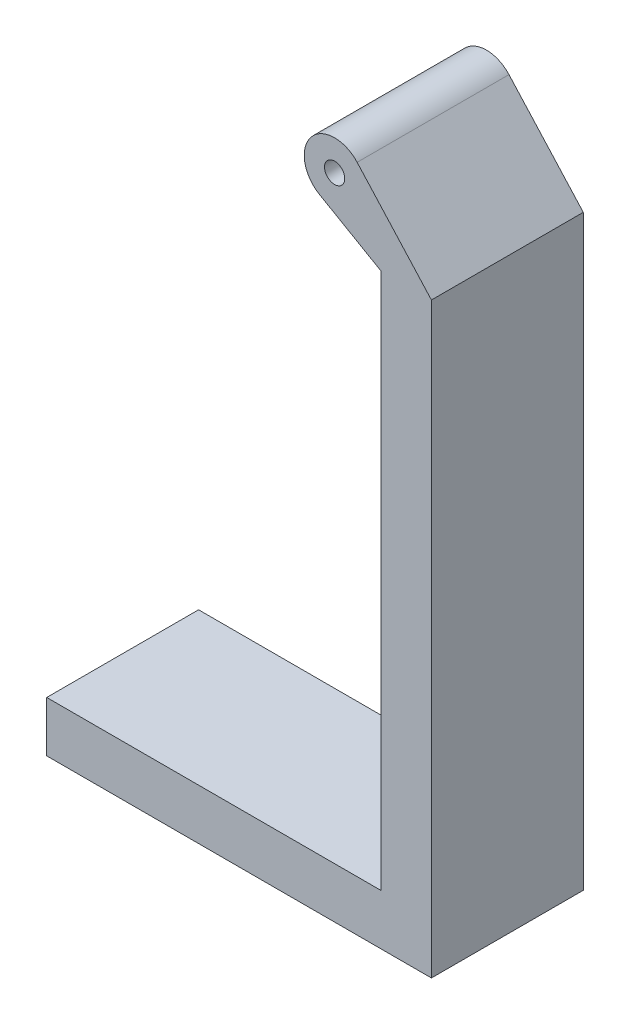
ISO-10303-21;
HEADER;
FILE_DESCRIPTION(('STEP AP214'),'2;1');
FILE_NAME('part.step','',(''),(''),'','','');
FILE_SCHEMA(('AUTOMOTIVE_DESIGN { 1 0 10303 214 1 1 1 1 }'));
ENDSEC;
DATA;
#1=APPLICATION_CONTEXT('core data for automotive mechanical design processes');
#2=APPLICATION_PROTOCOL_DEFINITION('international standard','automotive_design',2000,#1);
#3=PRODUCT_CONTEXT('',#1,'mechanical');
#4=PRODUCT('Part','Part','',(#3));
#5=PRODUCT_RELATED_PRODUCT_CATEGORY('part','',(#4));
#6=PRODUCT_DEFINITION_FORMATION('','',#4);
#7=PRODUCT_DEFINITION_CONTEXT('part definition',#1,'design');
#8=PRODUCT_DEFINITION('design','',#6,#7);
#9=PRODUCT_DEFINITION_SHAPE('','',#8);
#10=(LENGTH_UNIT() NAMED_UNIT(*) SI_UNIT(.MILLI.,.METRE.));
#11=(NAMED_UNIT(*) PLANE_ANGLE_UNIT() SI_UNIT($,.RADIAN.));
#12=(NAMED_UNIT(*) SI_UNIT($,.STERADIAN.) SOLID_ANGLE_UNIT());
#13=UNCERTAINTY_MEASURE_WITH_UNIT(LENGTH_MEASURE(1.E-05),#10,'distance_accuracy_value','');
#14=(GEOMETRIC_REPRESENTATION_CONTEXT(3) GLOBAL_UNCERTAINTY_ASSIGNED_CONTEXT((#13)) GLOBAL_UNIT_ASSIGNED_CONTEXT((#10,
#11,#12)) REPRESENTATION_CONTEXT('',''));
#15=CARTESIAN_POINT('',(0.,0.,0.));
#16=DIRECTION('',(0.,0.,1.));
#17=DIRECTION('',(1.,0.,0.));
#18=AXIS2_PLACEMENT_3D('',#15,#16,#17);
#19=CARTESIAN_POINT('',(0.,5.,15.));
#20=DIRECTION('',(1.,0.,0.));
#21=DIRECTION('',(0.,1.,0.));
#22=AXIS2_PLACEMENT_3D('',#19,#20,#21);
#23=PLANE('',#22);
#24=DIRECTION('',(0.,-1.,0.));
#25=VECTOR('',#24,1.);
#26=CARTESIAN_POINT('',(0.,5.,0.));
#27=LINE('',#26,#25);
#28=CARTESIAN_POINT('',(0.,5.,0.));
#29=VERTEX_POINT('',#28);
#30=CARTESIAN_POINT('',(0.,0.,0.));
#31=VERTEX_POINT('',#30);
#32=EDGE_CURVE('E128',#29,#31,#27,.T.);
#33=ORIENTED_EDGE('',*,*,#32,.T.);
#34=DIRECTION('',(0.,0.,-1.));
#35=VECTOR('',#34,1.);
#36=CARTESIAN_POINT('',(0.,0.,15.));
#37=LINE('',#36,#35);
#38=CARTESIAN_POINT('',(0.,0.,15.));
#39=VERTEX_POINT('',#38);
#40=EDGE_CURVE('E11',#39,#31,#37,.T.);
#41=ORIENTED_EDGE('',*,*,#40,.F.);
#42=DIRECTION('',(0.,-1.,0.));
#43=VECTOR('',#42,1.);
#44=CARTESIAN_POINT('',(0.,5.,15.));
#45=LINE('',#44,#43);
#46=CARTESIAN_POINT('',(0.,5.,15.));
#47=VERTEX_POINT('',#46);
#48=EDGE_CURVE('E132',#47,#39,#45,.T.);
#49=ORIENTED_EDGE('',*,*,#48,.F.);
#50=DIRECTION('',(0.,0.,-1.));
#51=VECTOR('',#50,1.);
#52=CARTESIAN_POINT('',(0.,5.,15.));
#53=LINE('',#52,#51);
#54=EDGE_CURVE('E137',#47,#29,#53,.T.);
#55=ORIENTED_EDGE('',*,*,#54,.T.);
#56=EDGE_LOOP('',(#33,#41,#49,#55));
#57=FACE_BOUND('',#56,.T.);
#58=ADVANCED_FACE('F33',(#57),#23,.F.);
#59=CARTESIAN_POINT('',(0.,0.,15.));
#60=DIRECTION('',(0.,1.,0.));
#61=DIRECTION('',(0.,0.,1.));
#62=AXIS2_PLACEMENT_3D('',#59,#60,#61);
#63=PLANE('',#62);
#64=DIRECTION('',(1.,0.,0.));
#65=VECTOR('',#64,1.);
#66=CARTESIAN_POINT('',(0.,0.,0.));
#67=LINE('',#66,#65);
#68=CARTESIAN_POINT('',(38.,0.,0.));
#69=VERTEX_POINT('',#68);
#70=EDGE_CURVE('E140',#31,#69,#67,.T.);
#71=ORIENTED_EDGE('',*,*,#70,.T.);
#72=DIRECTION('',(0.,0.,-1.));
#73=VECTOR('',#72,1.);
#74=CARTESIAN_POINT('',(38.,0.,15.));
#75=LINE('',#74,#73);
#76=CARTESIAN_POINT('',(38.,0.,15.));
#77=VERTEX_POINT('',#76);
#78=EDGE_CURVE('E42',#77,#69,#75,.T.);
#79=ORIENTED_EDGE('',*,*,#78,.F.);
#80=DIRECTION('',(1.,0.,0.));
#81=VECTOR('',#80,1.);
#82=CARTESIAN_POINT('',(0.,0.,15.));
#83=LINE('',#82,#81);
#84=EDGE_CURVE('E84',#39,#77,#83,.T.);
#85=ORIENTED_EDGE('',*,*,#84,.F.);
#86=ORIENTED_EDGE('',*,*,#40,.T.);
#87=EDGE_LOOP('',(#71,#79,#85,#86));
#88=FACE_BOUND('',#87,.T.);
#89=ADVANCED_FACE('F199',(#88),#63,.F.);
#90=CARTESIAN_POINT('',(38.,0.,15.));
#91=DIRECTION('',(-1.,0.,0.));
#92=DIRECTION('',(0.,0.,1.));
#93=AXIS2_PLACEMENT_3D('',#90,#91,#92);
#94=PLANE('',#93);
#95=DIRECTION('',(0.,1.,0.));
#96=VECTOR('',#95,1.);
#97=CARTESIAN_POINT('',(38.,0.,0.));
#98=LINE('',#97,#96);
#99=CARTESIAN_POINT('',(38.,58.,0.));
#100=VERTEX_POINT('',#99);
#101=EDGE_CURVE('E142',#69,#100,#98,.T.);
#102=ORIENTED_EDGE('',*,*,#101,.T.);
#103=DIRECTION('',(0.,0.,-1.));
#104=VECTOR('',#103,1.);
#105=CARTESIAN_POINT('',(38.,58.,15.));
#106=LINE('',#105,#104);
#107=CARTESIAN_POINT('',(38.,58.,15.));
#108=VERTEX_POINT('',#107);
#109=EDGE_CURVE('E109',#108,#100,#106,.T.);
#110=ORIENTED_EDGE('',*,*,#109,.F.);
#111=DIRECTION('',(0.,1.,0.));
#112=VECTOR('',#111,1.);
#113=CARTESIAN_POINT('',(38.,0.,15.));
#114=LINE('',#113,#112);
#115=EDGE_CURVE('E99',#77,#108,#114,.T.);
#116=ORIENTED_EDGE('',*,*,#115,.F.);
#117=ORIENTED_EDGE('',*,*,#78,.T.);
#118=EDGE_LOOP('',(#102,#110,#116,#117));
#119=FACE_BOUND('',#118,.T.);
#120=ADVANCED_FACE('F155',(#119),#94,.F.);
#121=CARTESIAN_POINT('',(33.,58.,15.));
#122=DIRECTION('',(1.,0.,0.));
#123=DIRECTION('',(0.,1.,0.));
#124=AXIS2_PLACEMENT_3D('',#121,#122,#123);
#125=PLANE('',#124);
#126=DIRECTION('',(0.,-1.,0.));
#127=VECTOR('',#126,1.);
#128=CARTESIAN_POINT('',(33.,58.,0.));
#129=LINE('',#128,#127);
#130=CARTESIAN_POINT('',(33.,58.,0.));
#131=VERTEX_POINT('',#130);
#132=CARTESIAN_POINT('',(33.,5.,0.));
#133=VERTEX_POINT('',#132);
#134=EDGE_CURVE('E70',#131,#133,#129,.T.);
#135=ORIENTED_EDGE('',*,*,#134,.T.);
#136=DIRECTION('',(0.,0.,-1.));
#137=VECTOR('',#136,1.);
#138=CARTESIAN_POINT('',(33.,5.,15.));
#139=LINE('',#138,#137);
#140=CARTESIAN_POINT('',(33.,5.,15.));
#141=VERTEX_POINT('',#140);
#142=EDGE_CURVE('E97',#141,#133,#139,.T.);
#143=ORIENTED_EDGE('',*,*,#142,.F.);
#144=DIRECTION('',(0.,-1.,0.));
#145=VECTOR('',#144,1.);
#146=CARTESIAN_POINT('',(33.,58.,15.));
#147=LINE('',#146,#145);
#148=CARTESIAN_POINT('',(33.,58.,15.));
#149=VERTEX_POINT('',#148);
#150=EDGE_CURVE('E93',#149,#141,#147,.T.);
#151=ORIENTED_EDGE('',*,*,#150,.F.);
#152=DIRECTION('',(0.,0.,-1.));
#153=VECTOR('',#152,1.);
#154=CARTESIAN_POINT('',(33.,58.,15.));
#155=LINE('',#154,#153);
#156=EDGE_CURVE('E96',#149,#131,#155,.T.);
#157=ORIENTED_EDGE('',*,*,#156,.T.);
#158=EDGE_LOOP('',(#135,#143,#151,#157));
#159=FACE_BOUND('',#158,.T.);
#160=ADVANCED_FACE('F95',(#159),#125,.F.);
#161=CARTESIAN_POINT('',(33.,5.,15.));
#162=DIRECTION('',(0.,-1.,0.));
#163=DIRECTION('',(1.,0.,0.));
#164=AXIS2_PLACEMENT_3D('',#161,#162,#163);
#165=PLANE('',#164);
#166=DIRECTION('',(-1.,0.,0.));
#167=VECTOR('',#166,1.);
#168=CARTESIAN_POINT('',(33.,5.,0.));
#169=LINE('',#168,#167);
#170=EDGE_CURVE('E76',#133,#29,#169,.T.);
#171=ORIENTED_EDGE('',*,*,#170,.T.);
#172=ORIENTED_EDGE('',*,*,#54,.F.);
#173=DIRECTION('',(-1.,0.,0.));
#174=VECTOR('',#173,1.);
#175=CARTESIAN_POINT('',(33.,5.,15.));
#176=LINE('',#175,#174);
#177=EDGE_CURVE('E50',#141,#47,#176,.T.);
#178=ORIENTED_EDGE('',*,*,#177,.F.);
#179=ORIENTED_EDGE('',*,*,#142,.T.);
#180=EDGE_LOOP('',(#171,#172,#178,#179));
#181=FACE_BOUND('',#180,.T.);
#182=ADVANCED_FACE('F189',(#181),#165,.F.);
#183=CARTESIAN_POINT('',(0.,0.,15.));
#184=DIRECTION('',(0.,0.,1.));
#185=DIRECTION('',(1.,0.,0.));
#186=AXIS2_PLACEMENT_3D('',#183,#184,#185);
#187=PLANE('',#186);
#188=CARTESIAN_POINT('',(28.4378221735089,64.0980762113533,15.));
#189=DIRECTION('',(0.,0.,1.));
#190=DIRECTION('',(1.,0.,0.));
#191=AXIS2_PLACEMENT_3D('',#188,#189,#190);
#192=CIRCLE('',#191,1.);
#193=CARTESIAN_POINT('',(29.4378221735089,64.0980762113533,15.));
#194=VERTEX_POINT('',#193);
#195=EDGE_CURVE('E178',#194,#194,#192,.T.);
#196=ORIENTED_EDGE('',*,*,#195,.F.);
#197=EDGE_LOOP('',(#196));
#198=FACE_BOUND('',#197,.T.);
#199=ORIENTED_EDGE('',*,*,#48,.T.);
#200=ORIENTED_EDGE('',*,*,#84,.T.);
#201=ORIENTED_EDGE('',*,*,#115,.T.);
#202=DIRECTION('',(-0.670873755735689,0.741571577034268,0.));
#203=VECTOR('',#202,1.);
#204=CARTESIAN_POINT('',(30.6625369046117,66.1106974785604,15.));
#205=LINE('',#204,#203);
#206=CARTESIAN_POINT('',(30.6625369046117,66.1106974785604,15.));
#207=VERTEX_POINT('',#206);
#208=EDGE_CURVE('E121',#108,#207,#205,.T.);
#209=ORIENTED_EDGE('',*,*,#208,.T.);
#210=CARTESIAN_POINT('',(28.4378221735089,64.0980762113533,15.));
#211=DIRECTION('',(0.,0.,1.));
#212=DIRECTION('',(-1.,0.,0.));
#213=AXIS2_PLACEMENT_3D('',#210,#211,#212);
#214=CIRCLE('',#213,2.99999999999999);
#215=CARTESIAN_POINT('',(26.9378221735089,61.5,15.));
#216=VERTEX_POINT('',#215);
#217=EDGE_CURVE('E115',#207,#216,#214,.T.);
#218=ORIENTED_EDGE('',*,*,#217,.T.);
#219=DIRECTION('',(0.866025403784436,-0.500000000000005,0.));
#220=VECTOR('',#219,1.);
#221=CARTESIAN_POINT('',(33.,58.,15.));
#222=LINE('',#221,#220);
#223=EDGE_CURVE('E106',#216,#149,#222,.T.);
#224=ORIENTED_EDGE('',*,*,#223,.T.);
#225=ORIENTED_EDGE('',*,*,#150,.T.);
#226=ORIENTED_EDGE('',*,*,#177,.T.);
#227=EDGE_LOOP('',(#199,#200,#201,#209,#218,#224,#225,#226));
#228=FACE_BOUND('',#227,.T.);
#229=ADVANCED_FACE('F112',(#198,#228),#187,.T.);
#230=CARTESIAN_POINT('',(0.,0.,0.));
#231=DIRECTION('',(0.,0.,1.));
#232=DIRECTION('',(1.,0.,0.));
#233=AXIS2_PLACEMENT_3D('',#230,#231,#232);
#234=PLANE('',#233);
#235=CARTESIAN_POINT('',(28.4378221735089,64.0980762113533,0.));
#236=DIRECTION('',(0.,0.,1.));
#237=DIRECTION('',(1.,0.,0.));
#238=AXIS2_PLACEMENT_3D('',#235,#236,#237);
#239=CIRCLE('',#238,1.);
#240=CARTESIAN_POINT('',(29.4378221735089,64.0980762113533,0.));
#241=VERTEX_POINT('',#240);
#242=EDGE_CURVE('E36',#241,#241,#239,.T.);
#243=ORIENTED_EDGE('',*,*,#242,.T.);
#244=EDGE_LOOP('',(#243));
#245=FACE_BOUND('',#244,.T.);
#246=ORIENTED_EDGE('',*,*,#32,.F.);
#247=ORIENTED_EDGE('',*,*,#170,.F.);
#248=ORIENTED_EDGE('',*,*,#134,.F.);
#249=DIRECTION('',(0.866025403784436,-0.500000000000005,0.));
#250=VECTOR('',#249,1.);
#251=CARTESIAN_POINT('',(33.,58.,0.));
#252=LINE('',#251,#250);
#253=CARTESIAN_POINT('',(26.9378221735089,61.5,0.));
#254=VERTEX_POINT('',#253);
#255=EDGE_CURVE('E108',#254,#131,#252,.T.);
#256=ORIENTED_EDGE('',*,*,#255,.F.);
#257=CARTESIAN_POINT('',(28.4378221735089,64.0980762113533,0.));
#258=DIRECTION('',(0.,0.,1.));
#259=DIRECTION('',(-1.,0.,0.));
#260=AXIS2_PLACEMENT_3D('',#257,#258,#259);
#261=CIRCLE('',#260,2.99999999999999);
#262=CARTESIAN_POINT('',(30.6625369046117,66.1106974785604,0.));
#263=VERTEX_POINT('',#262);
#264=EDGE_CURVE('E119',#263,#254,#261,.T.);
#265=ORIENTED_EDGE('',*,*,#264,.F.);
#266=DIRECTION('',(-0.670873755735689,0.741571577034268,0.));
#267=VECTOR('',#266,1.);
#268=CARTESIAN_POINT('',(30.6625369046117,66.1106974785604,0.));
#269=LINE('',#268,#267);
#270=EDGE_CURVE('E116',#100,#263,#269,.T.);
#271=ORIENTED_EDGE('',*,*,#270,.F.);
#272=ORIENTED_EDGE('',*,*,#101,.F.);
#273=ORIENTED_EDGE('',*,*,#70,.F.);
#274=EDGE_LOOP('',(#246,#247,#248,#256,#265,#271,#272,#273));
#275=FACE_BOUND('',#274,.T.);
#276=ADVANCED_FACE('F161',(#245,#275),#234,.F.);
#277=CARTESIAN_POINT('',(33.,58.,0.));
#278=DIRECTION('',(-0.500000000000005,-0.866025403784435,0.));
#279=DIRECTION('',(0.866025403784436,-0.500000000000005,0.));
#280=AXIS2_PLACEMENT_3D('',#277,#278,#279);
#281=PLANE('',#280);
#282=ORIENTED_EDGE('',*,*,#223,.F.);
#283=DIRECTION('',(0.,0.,1.));
#284=VECTOR('',#283,1.);
#285=CARTESIAN_POINT('',(26.9378221735089,61.5,0.));
#286=LINE('',#285,#284);
#287=EDGE_CURVE('E125',#254,#216,#286,.T.);
#288=ORIENTED_EDGE('',*,*,#287,.F.);
#289=ORIENTED_EDGE('',*,*,#255,.T.);
#290=ORIENTED_EDGE('',*,*,#156,.F.);
#291=EDGE_LOOP('',(#282,#288,#289,#290));
#292=FACE_BOUND('',#291,.T.);
#293=ADVANCED_FACE('F104',(#292),#281,.T.);
#294=CARTESIAN_POINT('',(28.4378221735089,64.0980762113533,0.));
#295=DIRECTION('',(0.,0.,1.));
#296=DIRECTION('',(1.,0.,0.));
#297=AXIS2_PLACEMENT_3D('',#294,#295,#296);
#298=CYLINDRICAL_SURFACE('',#297,2.99999999999999);
#299=ORIENTED_EDGE('',*,*,#217,.F.);
#300=DIRECTION('',(0.,0.,1.));
#301=VECTOR('',#300,1.);
#302=CARTESIAN_POINT('',(30.6625369046117,66.1106974785604,0.));
#303=LINE('',#302,#301);
#304=EDGE_CURVE('E129',#263,#207,#303,.T.);
#305=ORIENTED_EDGE('',*,*,#304,.F.);
#306=ORIENTED_EDGE('',*,*,#264,.T.);
#307=ORIENTED_EDGE('',*,*,#287,.T.);
#308=EDGE_LOOP('',(#299,#305,#306,#307));
#309=FACE_BOUND('',#308,.T.);
#310=ADVANCED_FACE('F174',(#309),#298,.T.);
#311=CARTESIAN_POINT('',(30.6625369046117,66.1106974785604,0.));
#312=DIRECTION('',(0.741571577034268,0.670873755735689,0.));
#313=DIRECTION('',(-0.670873755735689,0.741571577034268,0.));
#314=AXIS2_PLACEMENT_3D('',#311,#312,#313);
#315=PLANE('',#314);
#316=ORIENTED_EDGE('',*,*,#208,.F.);
#317=ORIENTED_EDGE('',*,*,#109,.T.);
#318=ORIENTED_EDGE('',*,*,#270,.T.);
#319=ORIENTED_EDGE('',*,*,#304,.T.);
#320=EDGE_LOOP('',(#316,#317,#318,#319));
#321=FACE_BOUND('',#320,.T.);
#322=ADVANCED_FACE('F168',(#321),#315,.T.);
#323=CARTESIAN_POINT('',(28.4378221735089,64.0980762113533,-10.));
#324=DIRECTION('',(0.,0.,1.));
#325=DIRECTION('',(1.,0.,0.));
#326=AXIS2_PLACEMENT_3D('',#323,#324,#325);
#327=CYLINDRICAL_SURFACE('',#326,1.);
#328=ORIENTED_EDGE('',*,*,#195,.T.);
#329=EDGE_LOOP('',(#328));
#330=FACE_BOUND('',#329,.T.);
#331=ORIENTED_EDGE('',*,*,#242,.F.);
#332=EDGE_LOOP('',(#331));
#333=FACE_BOUND('',#332,.T.);
#334=ADVANCED_FACE('F185',(#330,#333),#327,.F.);
#335=CLOSED_SHELL('',(#58,#89,#120,#160,#182,#229,#276,#293,#310,#322,#334));
#336=MANIFOLD_SOLID_BREP('B2',#335);
#337=ADVANCED_BREP_SHAPE_REPRESENTATION('',(#18,#336),#14);
#338=SHAPE_DEFINITION_REPRESENTATION(#9,#337);
ENDSEC;
END-ISO-10303-21;
